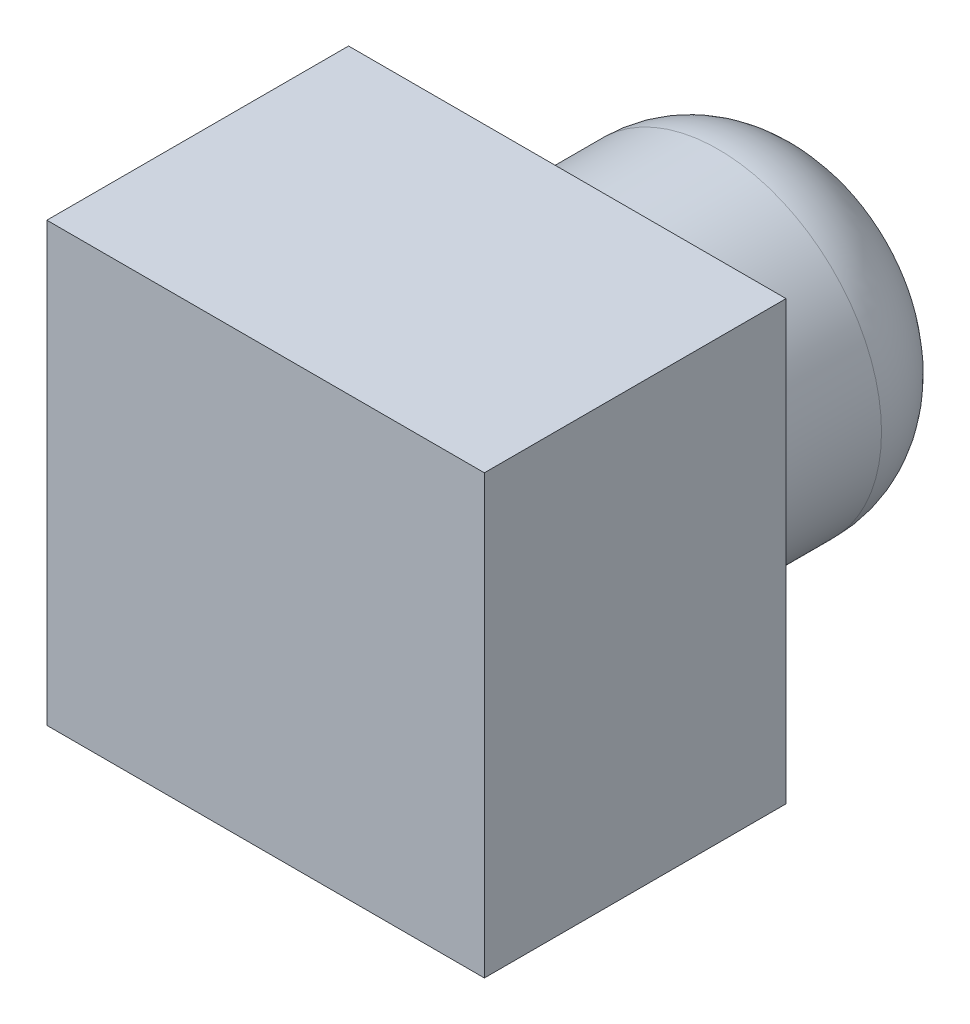
ISO-10303-21;
HEADER;
FILE_DESCRIPTION(('STEP AP214'),'2;1');
FILE_NAME('part.step','',(''),(''),'','','');
FILE_SCHEMA(('AUTOMOTIVE_DESIGN { 1 0 10303 214 1 1 1 1 }'));
ENDSEC;
DATA;
#1=APPLICATION_CONTEXT('core data for automotive mechanical design processes');
#2=APPLICATION_PROTOCOL_DEFINITION('international standard','automotive_design',2000,#1);
#3=PRODUCT_CONTEXT('',#1,'mechanical');
#4=PRODUCT('Part','Part','',(#3));
#5=PRODUCT_RELATED_PRODUCT_CATEGORY('part','',(#4));
#6=PRODUCT_DEFINITION_FORMATION('','',#4);
#7=PRODUCT_DEFINITION_CONTEXT('part definition',#1,'design');
#8=PRODUCT_DEFINITION('design','',#6,#7);
#9=PRODUCT_DEFINITION_SHAPE('','',#8);
#10=(LENGTH_UNIT() NAMED_UNIT(*) SI_UNIT(.MILLI.,.METRE.));
#11=(NAMED_UNIT(*) PLANE_ANGLE_UNIT() SI_UNIT($,.RADIAN.));
#12=(NAMED_UNIT(*) SI_UNIT($,.STERADIAN.) SOLID_ANGLE_UNIT());
#13=UNCERTAINTY_MEASURE_WITH_UNIT(LENGTH_MEASURE(1.E-05),#10,'distance_accuracy_value','');
#14=(GEOMETRIC_REPRESENTATION_CONTEXT(3) GLOBAL_UNCERTAINTY_ASSIGNED_CONTEXT((#13)) GLOBAL_UNIT_ASSIGNED_CONTEXT((#10,
#11,#12)) REPRESENTATION_CONTEXT('',''));
#15=CARTESIAN_POINT('',(0.,0.,0.));
#16=DIRECTION('',(0.,0.,1.));
#17=DIRECTION('',(1.,0.,0.));
#18=AXIS2_PLACEMENT_3D('',#15,#16,#17);
#19=CARTESIAN_POINT('',(1.105,1.105,1.524));
#20=DIRECTION('',(-1.,0.,0.));
#21=DIRECTION('',(0.,-1.,0.));
#22=AXIS2_PLACEMENT_3D('',#19,#20,#21);
#23=PLANE('',#22);
#24=DIRECTION('',(0.,1.,0.));
#25=VECTOR('',#24,1.);
#26=CARTESIAN_POINT('',(1.105,1.105,0.));
#27=LINE('',#26,#25);
#28=CARTESIAN_POINT('',(1.105,-1.105,0.));
#29=VERTEX_POINT('',#28);
#30=CARTESIAN_POINT('',(1.105,1.105,0.));
#31=VERTEX_POINT('',#30);
#32=EDGE_CURVE('E106',#29,#31,#27,.T.);
#33=ORIENTED_EDGE('',*,*,#32,.T.);
#34=DIRECTION('',(0.,0.,-1.));
#35=VECTOR('',#34,1.);
#36=CARTESIAN_POINT('',(1.105,1.105,1.524));
#37=LINE('',#36,#35);
#38=CARTESIAN_POINT('',(1.105,1.105,1.524));
#39=VERTEX_POINT('',#38);
#40=EDGE_CURVE('E97',#39,#31,#37,.T.);
#41=ORIENTED_EDGE('',*,*,#40,.F.);
#42=DIRECTION('',(0.,1.,0.));
#43=VECTOR('',#42,1.);
#44=CARTESIAN_POINT('',(1.105,1.105,1.524));
#45=LINE('',#44,#43);
#46=CARTESIAN_POINT('',(1.105,-1.105,1.524));
#47=VERTEX_POINT('',#46);
#48=EDGE_CURVE('E91',#47,#39,#45,.T.);
#49=ORIENTED_EDGE('',*,*,#48,.F.);
#50=DIRECTION('',(0.,0.,-1.));
#51=VECTOR('',#50,1.);
#52=CARTESIAN_POINT('',(1.105,-1.105,1.524));
#53=LINE('',#52,#51);
#54=EDGE_CURVE('E102',#47,#29,#53,.T.);
#55=ORIENTED_EDGE('',*,*,#54,.T.);
#56=EDGE_LOOP('',(#33,#41,#49,#55));
#57=FACE_BOUND('',#56,.T.);
#58=ADVANCED_FACE('F38',(#57),#23,.F.);
#59=CARTESIAN_POINT('',(-1.105,1.105,1.524));
#60=DIRECTION('',(0.,-1.,0.));
#61=DIRECTION('',(0.,0.,-1.));
#62=AXIS2_PLACEMENT_3D('',#59,#60,#61);
#63=PLANE('',#62);
#64=DIRECTION('',(-1.,0.,0.));
#65=VECTOR('',#64,1.);
#66=CARTESIAN_POINT('',(-1.105,1.105,0.));
#67=LINE('',#66,#65);
#68=CARTESIAN_POINT('',(-1.105,1.105,0.));
#69=VERTEX_POINT('',#68);
#70=EDGE_CURVE('E96',#31,#69,#67,.T.);
#71=ORIENTED_EDGE('',*,*,#70,.T.);
#72=DIRECTION('',(0.,0.,-1.));
#73=VECTOR('',#72,1.);
#74=CARTESIAN_POINT('',(-1.105,1.105,1.524));
#75=LINE('',#74,#73);
#76=CARTESIAN_POINT('',(-1.105,1.105,1.524));
#77=VERTEX_POINT('',#76);
#78=EDGE_CURVE('E94',#77,#69,#75,.T.);
#79=ORIENTED_EDGE('',*,*,#78,.F.);
#80=DIRECTION('',(-1.,0.,0.));
#81=VECTOR('',#80,1.);
#82=CARTESIAN_POINT('',(-1.105,1.105,1.524));
#83=LINE('',#82,#81);
#84=EDGE_CURVE('E86',#39,#77,#83,.T.);
#85=ORIENTED_EDGE('',*,*,#84,.F.);
#86=ORIENTED_EDGE('',*,*,#40,.T.);
#87=EDGE_LOOP('',(#71,#79,#85,#86));
#88=FACE_BOUND('',#87,.T.);
#89=ADVANCED_FACE('F95',(#88),#63,.F.);
#90=CARTESIAN_POINT('',(-1.105,1.105,1.524));
#91=DIRECTION('',(1.,0.,0.));
#92=DIRECTION('',(0.,1.,0.));
#93=AXIS2_PLACEMENT_3D('',#90,#91,#92);
#94=PLANE('',#93);
#95=DIRECTION('',(0.,-1.,0.));
#96=VECTOR('',#95,1.);
#97=CARTESIAN_POINT('',(-1.105,1.105,0.));
#98=LINE('',#97,#96);
#99=CARTESIAN_POINT('',(-1.105,-1.105,0.));
#100=VERTEX_POINT('',#99);
#101=EDGE_CURVE('E72',#69,#100,#98,.T.);
#102=ORIENTED_EDGE('',*,*,#101,.T.);
#103=DIRECTION('',(0.,0.,-1.));
#104=VECTOR('',#103,1.);
#105=CARTESIAN_POINT('',(-1.105,-1.105,1.524));
#106=LINE('',#105,#104);
#107=CARTESIAN_POINT('',(-1.105,-1.105,1.524));
#108=VERTEX_POINT('',#107);
#109=EDGE_CURVE('E98',#108,#100,#106,.T.);
#110=ORIENTED_EDGE('',*,*,#109,.F.);
#111=DIRECTION('',(0.,-1.,0.));
#112=VECTOR('',#111,1.);
#113=CARTESIAN_POINT('',(-1.105,1.105,1.524));
#114=LINE('',#113,#112);
#115=EDGE_CURVE('E89',#77,#108,#114,.T.);
#116=ORIENTED_EDGE('',*,*,#115,.F.);
#117=ORIENTED_EDGE('',*,*,#78,.T.);
#118=EDGE_LOOP('',(#102,#110,#116,#117));
#119=FACE_BOUND('',#118,.T.);
#120=ADVANCED_FACE('F100',(#119),#94,.F.);
#121=CARTESIAN_POINT('',(-1.105,-1.105,1.524));
#122=DIRECTION('',(0.,1.,0.));
#123=DIRECTION('',(0.,0.,1.));
#124=AXIS2_PLACEMENT_3D('',#121,#122,#123);
#125=PLANE('',#124);
#126=DIRECTION('',(1.,0.,0.));
#127=VECTOR('',#126,1.);
#128=CARTESIAN_POINT('',(-1.105,-1.105,0.));
#129=LINE('',#128,#127);
#130=EDGE_CURVE('E78',#100,#29,#129,.T.);
#131=ORIENTED_EDGE('',*,*,#130,.T.);
#132=ORIENTED_EDGE('',*,*,#54,.F.);
#133=DIRECTION('',(1.,0.,0.));
#134=VECTOR('',#133,1.);
#135=CARTESIAN_POINT('',(-1.105,-1.105,1.524));
#136=LINE('',#135,#134);
#137=EDGE_CURVE('E55',#108,#47,#136,.T.);
#138=ORIENTED_EDGE('',*,*,#137,.F.);
#139=ORIENTED_EDGE('',*,*,#109,.T.);
#140=EDGE_LOOP('',(#131,#132,#138,#139));
#141=FACE_BOUND('',#140,.T.);
#142=ADVANCED_FACE('F130',(#141),#125,.F.);
#143=CARTESIAN_POINT('',(0.,0.,1.524));
#144=DIRECTION('',(0.,0.,1.));
#145=DIRECTION('',(1.,0.,0.));
#146=AXIS2_PLACEMENT_3D('',#143,#144,#145);
#147=PLANE('',#146);
#148=ORIENTED_EDGE('',*,*,#48,.T.);
#149=ORIENTED_EDGE('',*,*,#84,.T.);
#150=ORIENTED_EDGE('',*,*,#115,.T.);
#151=ORIENTED_EDGE('',*,*,#137,.T.);
#152=EDGE_LOOP('',(#148,#149,#150,#151));
#153=FACE_BOUND('',#152,.T.);
#154=ADVANCED_FACE('F87',(#153),#147,.T.);
#155=CARTESIAN_POINT('',(0.,0.,0.));
#156=DIRECTION('',(0.,0.,1.));
#157=DIRECTION('',(1.,0.,0.));
#158=AXIS2_PLACEMENT_3D('',#155,#156,#157);
#159=PLANE('',#158);
#160=CARTESIAN_POINT('',(0.,0.,0.));
#161=DIRECTION('',(0.,0.,-1.));
#162=DIRECTION('',(-1.,0.,0.));
#163=AXIS2_PLACEMENT_3D('',#160,#161,#162);
#164=CIRCLE('',#163,0.825);
#165=CARTESIAN_POINT('',(-0.825,0.,0.));
#166=VERTEX_POINT('',#165);
#167=EDGE_CURVE('E114',#166,#166,#164,.T.);
#168=ORIENTED_EDGE('',*,*,#167,.F.);
#169=EDGE_LOOP('',(#168));
#170=FACE_BOUND('',#169,.T.);
#171=ORIENTED_EDGE('',*,*,#32,.F.);
#172=ORIENTED_EDGE('',*,*,#130,.F.);
#173=ORIENTED_EDGE('',*,*,#101,.F.);
#174=ORIENTED_EDGE('',*,*,#70,.F.);
#175=EDGE_LOOP('',(#171,#172,#173,#174));
#176=FACE_BOUND('',#175,.T.);
#177=ADVANCED_FACE('F124',(#170,#176),#159,.F.);
#178=CARTESIAN_POINT('',(0.,0.,-1.27));
#179=DIRECTION('',(0.,0.,1.));
#180=DIRECTION('',(1.,0.,0.));
#181=AXIS2_PLACEMENT_3D('',#178,#179,#180);
#182=CYLINDRICAL_SURFACE('',#181,0.825);
#183=CARTESIAN_POINT('',(0.,0.,-0.762));
#184=DIRECTION('',(0.,0.,-1.));
#185=DIRECTION('',(-1.,0.,0.));
#186=AXIS2_PLACEMENT_3D('',#183,#184,#185);
#187=CIRCLE('',#186,0.825);
#188=CARTESIAN_POINT('',(-0.825,0.,-0.762));
#189=VERTEX_POINT('',#188);
#190=EDGE_CURVE('E11',#189,#189,#187,.F.);
#191=ORIENTED_EDGE('',*,*,#190,.T.);
#192=EDGE_LOOP('',(#191));
#193=FACE_BOUND('',#192,.T.);
#194=ORIENTED_EDGE('',*,*,#167,.T.);
#195=EDGE_LOOP('',(#194));
#196=FACE_BOUND('',#195,.T.);
#197=ADVANCED_FACE('F122',(#193,#196),#182,.T.);
#198=CARTESIAN_POINT('',(0.,0.,-1.27));
#199=DIRECTION('',(0.,0.,-1.));
#200=DIRECTION('',(-1.,0.,0.));
#201=AXIS2_PLACEMENT_3D('',#198,#199,#200);
#202=PLANE('',#201);
#203=CARTESIAN_POINT('',(0.,0.,-1.27));
#204=DIRECTION('',(0.,0.,-1.));
#205=DIRECTION('',(-1.,0.,0.));
#206=AXIS2_PLACEMENT_3D('',#203,#204,#205);
#207=CIRCLE('',#206,0.317);
#208=CARTESIAN_POINT('',(-0.317,0.,-1.27));
#209=VERTEX_POINT('',#208);
#210=EDGE_CURVE('E47',#209,#209,#207,.T.);
#211=ORIENTED_EDGE('',*,*,#210,.T.);
#212=EDGE_LOOP('',(#211));
#213=FACE_BOUND('',#212,.T.);
#214=ADVANCED_FACE('F176',(#213),#202,.T.);
#215=CARTESIAN_POINT('',(0.,0.,-0.762));
#216=DIRECTION('',(0.,0.,-1.));
#217=DIRECTION('',(-1.,0.,0.));
#218=AXIS2_PLACEMENT_3D('',#215,#216,#217);
#219=DEGENERATE_TOROIDAL_SURFACE('',#218,0.317,0.508,.T.);
#220=ORIENTED_EDGE('',*,*,#190,.F.);
#221=EDGE_LOOP('',(#220));
#222=FACE_BOUND('',#221,.T.);
#223=ORIENTED_EDGE('',*,*,#210,.F.);
#224=EDGE_LOOP('',(#223));
#225=FACE_BOUND('',#224,.T.);
#226=ADVANCED_FACE('F40',(#222,#225),#219,.T.);
#227=CLOSED_SHELL('',(#58,#89,#120,#142,#154,#177,#197,#214,#226));
#228=MANIFOLD_SOLID_BREP('B2',#227);
#229=ADVANCED_BREP_SHAPE_REPRESENTATION('',(#18,#228),#14);
#230=SHAPE_DEFINITION_REPRESENTATION(#9,#229);
ENDSEC;
END-ISO-10303-21;
